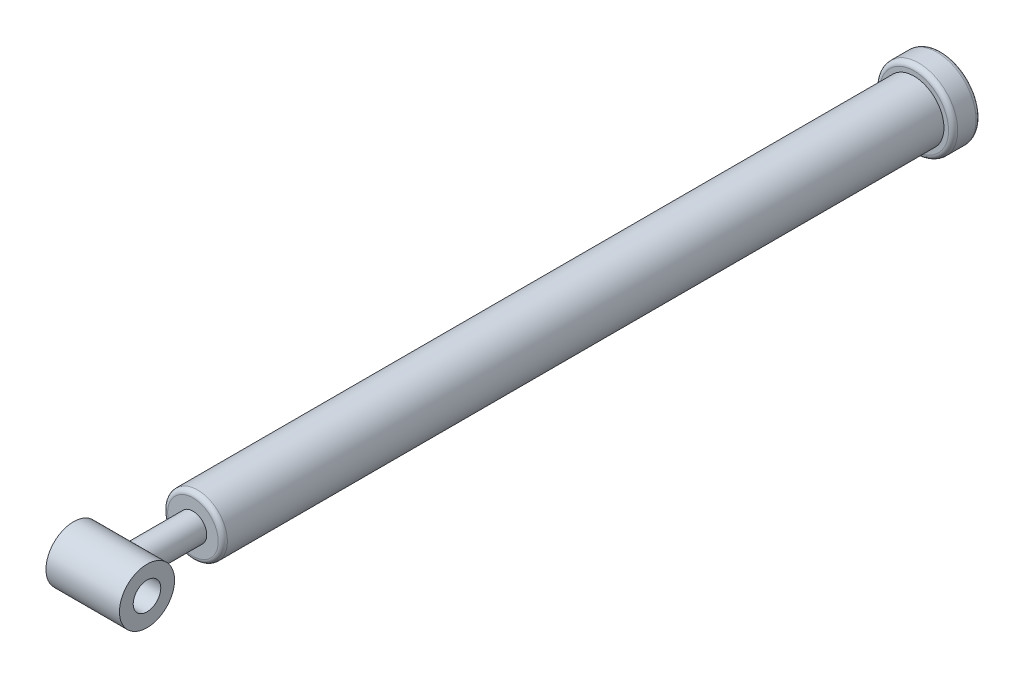
ISO-10303-21;
HEADER;
FILE_DESCRIPTION(('STEP AP214'),'2;1');
FILE_NAME('part.step','',(''),(''),'','','');
FILE_SCHEMA(('AUTOMOTIVE_DESIGN { 1 0 10303 214 1 1 1 1 }'));
ENDSEC;
DATA;
#1=APPLICATION_CONTEXT('core data for automotive mechanical design processes');
#2=APPLICATION_PROTOCOL_DEFINITION('international standard','automotive_design',2000,#1);
#3=PRODUCT_CONTEXT('',#1,'mechanical');
#4=PRODUCT('Part','Part','',(#3));
#5=PRODUCT_RELATED_PRODUCT_CATEGORY('part','',(#4));
#6=PRODUCT_DEFINITION_FORMATION('','',#4);
#7=PRODUCT_DEFINITION_CONTEXT('part definition',#1,'design');
#8=PRODUCT_DEFINITION('design','',#6,#7);
#9=PRODUCT_DEFINITION_SHAPE('','',#8);
#10=(LENGTH_UNIT() NAMED_UNIT(*) SI_UNIT(.MILLI.,.METRE.));
#11=(NAMED_UNIT(*) PLANE_ANGLE_UNIT() SI_UNIT($,.RADIAN.));
#12=(NAMED_UNIT(*) SI_UNIT($,.STERADIAN.) SOLID_ANGLE_UNIT());
#13=UNCERTAINTY_MEASURE_WITH_UNIT(LENGTH_MEASURE(1.E-05),#10,'distance_accuracy_value','');
#14=(GEOMETRIC_REPRESENTATION_CONTEXT(3) GLOBAL_UNCERTAINTY_ASSIGNED_CONTEXT((#13)) GLOBAL_UNIT_ASSIGNED_CONTEXT((#10,
#11,#12)) REPRESENTATION_CONTEXT('',''));
#15=CARTESIAN_POINT('',(0.,0.,0.));
#16=DIRECTION('',(0.,0.,1.));
#17=DIRECTION('',(1.,0.,0.));
#18=AXIS2_PLACEMENT_3D('',#15,#16,#17);
#19=CARTESIAN_POINT('',(0.,0.,850.));
#20=DIRECTION('',(0.,0.,-1.));
#21=DIRECTION('',(-1.,0.,0.));
#22=AXIS2_PLACEMENT_3D('',#19,#20,#21);
#23=CYLINDRICAL_SURFACE('',#22,15.);
#24=CARTESIAN_POINT('',(0.,0.,785.));
#25=DIRECTION('',(0.,0.,1.));
#26=DIRECTION('',(1.,0.,0.));
#27=AXIS2_PLACEMENT_3D('',#24,#25,#26);
#28=CIRCLE('',#27,15.);
#29=CARTESIAN_POINT('',(15.,0.,785.));
#30=VERTEX_POINT('',#29);
#31=EDGE_CURVE('E75',#30,#30,#28,.T.);
#32=ORIENTED_EDGE('',*,*,#31,.T.);
#33=EDGE_LOOP('',(#32));
#34=FACE_BOUND('',#33,.T.);
#35=CARTESIAN_POINT('',(-15.,0.,845.));
#36=CARTESIAN_POINT('',(-14.9999986967893,-0.394466621474774,845.000001198443));
#37=CARTESIAN_POINT('',(-14.9844217290986,-0.788960822893599,845.007798374441));
#38=CARTESIAN_POINT('',(-14.9222912626951,-1.57504384672489,845.038790696874));
#39=CARTESIAN_POINT('',(-14.8757242881962,-1.96663133023565,845.061992541911));
#40=CARTESIAN_POINT('',(-14.752062134402,-2.74444839066597,845.123245665512));
#41=CARTESIAN_POINT('',(-14.674915671778,-3.13066783309048,845.16132188759));
#42=CARTESIAN_POINT('',(-14.4909926788045,-3.89427274204148,845.251345482788));
#43=CARTESIAN_POINT('',(-14.3842191117729,-4.27165908796738,845.303291468627));
#44=CARTESIAN_POINT('',(-14.1426464967422,-5.01370255233915,845.419545464834));
#45=CARTESIAN_POINT('',(-14.0079586988167,-5.37840368544457,845.483804328683));
#46=CARTESIAN_POINT('',(-13.7115835174738,-6.09447648128181,845.623301187505));
#47=CARTESIAN_POINT('',(-13.5498955527415,-6.4458478568234,845.69853941886));
#48=CARTESIAN_POINT('',(-13.2009461452605,-7.1332709828304,845.858261390877));
#49=CARTESIAN_POINT('',(-13.0136941461368,-7.46932832959928,845.942741715132));
#50=CARTESIAN_POINT('',(-12.6148696065897,-8.12479620523714,846.119159593015));
#51=CARTESIAN_POINT('',(-12.4032874777652,-8.44420009848104,846.211100082431));
#52=CARTESIAN_POINT('',(-11.9437431549207,-9.08356730455508,846.406169485422));
#53=CARTESIAN_POINT('',(-11.6943566948693,-9.40240338911199,846.509638755958));
#54=CARTESIAN_POINT('',(-11.1713323045257,-10.0182110858624,846.720301058942));
#55=CARTESIAN_POINT('',(-10.8976929878613,-10.3151814463611,846.827494304051));
#56=CARTESIAN_POINT('',(-10.32744213221,-10.8860835918351,847.043134053405));
#57=CARTESIAN_POINT('',(-10.0308163772597,-11.1600008976787,847.151581297343));
#58=CARTESIAN_POINT('',(-9.41609706949254,-11.6833254232374,847.367048472574));
#59=CARTESIAN_POINT('',(-9.09799950074795,-11.9327280363632,847.474068132354));
#60=CARTESIAN_POINT('',(-8.41621019135655,-12.424066666325,847.692119687857));
#61=CARTESIAN_POINT('',(-8.05089693128163,-12.6639084928373,847.802814953086));
#62=CARTESIAN_POINT('',(-7.29906225682785,-13.1116371457317,848.01581142987));
#63=CARTESIAN_POINT('',(-6.91254992484986,-13.319537514021,848.118116190041));
#64=CARTESIAN_POINT('',(-6.12045119528938,-13.7015816677248,848.310817756053));
#65=CARTESIAN_POINT('',(-5.71487061752195,-13.8757356708103,848.40121816361));
#66=CARTESIAN_POINT('',(-4.88717106989483,-14.1884178363296,848.566685065391));
#67=CARTESIAN_POINT('',(-4.46505393858207,-14.3269499463523,848.641753258529));
#68=CARTESIAN_POINT('',(-3.6331274396609,-14.5593818816456,848.769465636118));
#69=CARTESIAN_POINT('',(-3.22409061692206,-14.6554546162323,848.823181991672));
#70=CARTESIAN_POINT('',(-2.3974253026042,-14.8131483158836,848.912093372582));
#71=CARTESIAN_POINT('',(-1.97979717934038,-14.874770754679,848.947289190214));
#72=CARTESIAN_POINT('',(-1.1399780978413,-14.9625716596024,848.997615020556));
#73=CARTESIAN_POINT('',(-0.717791304375857,-14.9887801055065,849.012762005415));
#74=CARTESIAN_POINT('',(0.127503752153197,-15.0054120092055,849.022361014937));
#75=CARTESIAN_POINT('',(0.550611923450829,-14.9958388811994,849.016815014078));
#76=CARTESIAN_POINT('',(1.34318604493256,-14.9443693637688,848.987185469988));
#77=CARTESIAN_POINT('',(1.7130074967434,-14.9064815133301,848.965401642622));
#78=CARTESIAN_POINT('',(2.44761394651885,-14.8036048078167,848.90676729953));
#79=CARTESIAN_POINT('',(2.81239941379462,-14.7386184959446,848.869918197694));
#80=CARTESIAN_POINT('',(3.53465011425935,-14.5822778462236,848.782349877417));
#81=CARTESIAN_POINT('',(3.89211348946939,-14.490916902454,848.731627184297));
#82=CARTESIAN_POINT('',(4.59755097022409,-14.2827793732036,848.617879915435));
#83=CARTESIAN_POINT('',(4.94552456919406,-14.1660014339124,848.554854684428));
#84=CARTESIAN_POINT('',(5.63806138553527,-13.9051185945145,848.416735657268));
#85=CARTESIAN_POINT('',(5.98236177926317,-13.7604466030275,848.341397479624));
#86=CARTESIAN_POINT('',(6.65764881287022,-13.4467240006948,848.181786349803));
#87=CARTESIAN_POINT('',(6.98863063670922,-13.2776646708395,848.097510204973));
#88=CARTESIAN_POINT('',(7.63583954119811,-12.9163207460711,847.922168121219));
#89=CARTESIAN_POINT('',(7.95206429387359,-12.7240325037789,847.831101116863));
#90=CARTESIAN_POINT('',(8.56852275615353,-12.3173373374607,847.644319137144));
#91=CARTESIAN_POINT('',(8.86875518007754,-12.1029286391493,847.548603789262));
#92=CARTESIAN_POINT('',(9.4892135610555,-11.6244221009996,847.342288154575));
#93=CARTESIAN_POINT('',(9.80713018813408,-11.357472454083,847.23134228918));
#94=CARTESIAN_POINT('',(10.4195910602953,-10.7983337273758,847.009171948651));
#95=CARTESIAN_POINT('',(10.7141433900476,-10.5061534517949,846.897947583749));
#96=CARTESIAN_POINT('',(11.2787205781467,-9.89761910582899,846.677890344788));
#97=CARTESIAN_POINT('',(11.5487236024522,-9.58124396820908,846.569059663621));
#98=CARTESIAN_POINT('',(12.0621805278786,-8.92619254193719,846.356648454252));
#99=CARTESIAN_POINT('',(12.3056450163623,-8.58752523371367,846.253065841263));
#100=CARTESIAN_POINT('',(12.7751937974681,-7.87309152384946,846.049027950798));
#101=CARTESIAN_POINT('',(12.999931268877,-7.49633062281164,845.94894596163));
#102=CARTESIAN_POINT('',(13.4165538554255,-6.72229496746225,845.760139769321));
#103=CARTESIAN_POINT('',(13.608437440683,-6.32501925897374,845.671416095143));
#104=CARTESIAN_POINT('',(13.9571914545699,-5.51289034160744,845.507976152198));
#105=CARTESIAN_POINT('',(14.1140841452216,-5.09804850978522,845.433250982128));
#106=CARTESIAN_POINT('',(14.391076168471,-4.25373396764104,845.300028469866));
#107=CARTESIAN_POINT('',(14.5111797336915,-3.82426294674312,845.241529260936));
#108=CARTESIAN_POINT('',(14.7045987917793,-2.99040123124789,845.146713024642));
#109=CARTESIAN_POINT('',(14.780965864728,-2.58687987737183,845.108959937918));
#110=CARTESIAN_POINT('',(14.9004227368483,-1.77375891598894,845.049709617986));
#111=CARTESIAN_POINT('',(14.9435143460633,-1.36415964033065,845.028211500579));
#112=CARTESIAN_POINT('',(14.9958394822899,-0.542432179601618,845.002088586177));
#113=CARTESIAN_POINT('',(15.0050865466642,-0.130305071717037,844.997457042783));
#114=CARTESIAN_POINT('',(14.9896332143828,0.693142933067776,845.005182902425));
#115=CARTESIAN_POINT('',(14.9649343201033,1.10446386484084,845.017539553599));
#116=CARTESIAN_POINT('',(14.8851569218173,1.89104365716466,845.057274299687));
#117=CARTESIAN_POINT('',(14.8325856924447,2.26662317638414,845.083411784036));
#118=CARTESIAN_POINT('',(14.6994449555599,3.01155508953995,845.149198828482));
#119=CARTESIAN_POINT('',(14.6188772495211,3.38090788254089,845.188847519177));
#120=CARTESIAN_POINT('',(14.4305792041858,4.11102643115709,845.280732355606));
#121=CARTESIAN_POINT('',(14.322847354219,4.47179170797618,845.332969201392));
#122=CARTESIAN_POINT('',(14.0812572947496,5.18257720416893,845.448848110263));
#123=CARTESIAN_POINT('',(13.9473979874992,5.53259697135359,845.512490652549));
#124=CARTESIAN_POINT('',(13.6505393721982,6.22979935488015,845.651753782206));
#125=CARTESIAN_POINT('',(13.4868176517073,6.576616120173,845.727664302393));
#126=CARTESIAN_POINT('',(13.1343016754682,7.25508680349727,845.88839960015));
#127=CARTESIAN_POINT('',(12.9455071994249,7.58674058826881,845.973224456043));
#128=CARTESIAN_POINT('',(12.5441531585986,8.23341158684491,846.149985850757));
#129=CARTESIAN_POINT('',(12.3315897999932,8.54842613296244,846.241923524154));
#130=CARTESIAN_POINT('',(11.8839483671782,9.16054648853287,846.431012285166));
#131=CARTESIAN_POINT('',(11.6488615394066,9.45764526147817,846.528165393215));
#132=CARTESIAN_POINT('',(11.1333715012893,10.060839107335,846.735341464201));
#133=CARTESIAN_POINT('',(10.8507851186195,10.3649587307601,846.845692143983));
#134=CARTESIAN_POINT('',(10.2616154855625,10.9485707923032,847.06746929941));
#135=CARTESIAN_POINT('',(9.9550311697726,11.2280621358615,847.178895822626));
#136=CARTESIAN_POINT('',(9.31919419442999,11.761157874002,847.400027289832));
#137=CARTESIAN_POINT('',(8.98992792709478,12.0147464980315,847.50973115101));
#138=CARTESIAN_POINT('',(8.31037887445767,12.4944228999317,847.724397948994));
#139=CARTESIAN_POINT('',(7.96009249191951,12.7205059505332,847.829360068912));
#140=CARTESIAN_POINT('',(7.22261605950783,13.1539172060939,848.036414537208));
#141=CARTESIAN_POINT('',(6.83445930863627,13.3597919511091,848.138116937488));
#142=CARTESIAN_POINT('',(6.03927850598328,13.737567232961,848.329340387484));
#143=CARTESIAN_POINT('',(5.63226376216402,13.9094843147169,848.418867362678));
#144=CARTESIAN_POINT('',(4.80217565091482,14.2174151642657,848.582288068273));
#145=CARTESIAN_POINT('',(4.37911544662186,14.353457663537,848.656194299646));
#146=CARTESIAN_POINT('',(3.51992505793521,14.5879514095295,848.78531598748));
#147=CARTESIAN_POINT('',(3.08379690851378,14.6864084766722,848.840534337767));
#148=CARTESIAN_POINT('',(2.24471283239244,14.8366134509912,848.925460869571));
#149=CARTESIAN_POINT('',(1.84259137531863,14.8919378625023,848.957109030588));
#150=CARTESIAN_POINT('',(1.0341590037221,14.9698153891526,849.0017947784));
#151=CARTESIAN_POINT('',(0.627848376009429,14.9923707330054,849.014833630864));
#152=CARTESIAN_POINT('',(-0.185270351507961,15.0043645010929,849.021757365319));
#153=CARTESIAN_POINT('',(-0.592078211651137,14.9938151743778,849.015649331845));
#154=CARTESIAN_POINT('',(-1.40275816467969,14.9397884815991,848.984549012312));
#155=CARTESIAN_POINT('',(-1.8066303770658,14.8963124635393,848.959557499333));
#156=CARTESIAN_POINT('',(-2.56967168244059,14.782795841076,848.894967278986));
#157=CARTESIAN_POINT('',(-2.92942204471818,14.7156934571528,848.856994150101));
#158=CARTESIAN_POINT('',(-3.64159381579529,14.5558242789108,848.767646667704));
#159=CARTESIAN_POINT('',(-3.99401275857395,14.4630489945772,848.716267881271));
#160=CARTESIAN_POINT('',(-4.68939648000361,14.2527724980854,848.601651711384));
#161=CARTESIAN_POINT('',(-5.03236114606179,14.1352709916016,848.538414186772));
#162=CARTESIAN_POINT('',(-5.707164316817,13.8765585244577,848.401832636467));
#163=CARTESIAN_POINT('',(-6.03900172289249,13.7353452308956,848.328487616466));
#164=CARTESIAN_POINT('',(-6.71194905721808,13.4200195538921,848.16836954442));
#165=CARTESIAN_POINT('',(-7.05218633738287,13.2443351386714,848.081025622915));
#166=CARTESIAN_POINT('',(-7.71683729888767,12.8684192321827,847.899310742732));
#167=CARTESIAN_POINT('',(-8.04125049766908,12.6681869929773,847.804939569978));
#168=CARTESIAN_POINT('',(-8.67307599887717,12.2442855818538,847.611466647555));
#169=CARTESIAN_POINT('',(-8.9804818359264,12.0206075892618,847.512363125188));
#170=CARTESIAN_POINT('',(-9.57700095794095,11.5509819278367,847.311734819274));
#171=CARTESIAN_POINT('',(-9.86611149224955,11.3050309237573,847.210209674785));
#172=CARTESIAN_POINT('',(-10.4588881043877,10.7607009160988,846.994588016576));
#173=CARTESIAN_POINT('',(-10.7600384098886,10.4595848725634,846.880466375821));
#174=CARTESIAN_POINT('',(-11.3360350079751,9.83237263592984,846.655062843985));
#175=CARTESIAN_POINT('',(-11.6108894699081,9.50628425805799,846.543780078878));
#176=CARTESIAN_POINT('',(-12.1328673274452,8.83040064495091,846.326840554529));
#177=CARTESIAN_POINT('',(-12.3799686513198,8.48058689086186,846.221188307768));
#178=CARTESIAN_POINT('',(-12.8443186951047,7.75934315416605,846.018404213271));
#179=CARTESIAN_POINT('',(-13.0615691351246,7.38791441884539,845.921271874707));
#180=CARTESIAN_POINT('',(-13.4657554418474,6.62283359834587,845.737499586337));
#181=CARTESIAN_POINT('',(-13.652463307469,6.22904153096556,845.650939674485));
#182=CARTESIAN_POINT('',(-13.9917304392215,5.42422205013373,845.491593102566));
#183=CARTESIAN_POINT('',(-14.1442848128173,5.01319217734312,845.418808416049));
#184=CARTESIAN_POINT('',(-14.4130312534336,4.17809175418138,845.289368363161));
#185=CARTESIAN_POINT('',(-14.52931393542,3.75405665560561,845.232672834932));
#186=CARTESIAN_POINT('',(-14.7244141315277,2.89570983328148,845.136960690795));
#187=CARTESIAN_POINT('',(-14.8032545313493,2.46140455781254,845.097933276359));
#188=CARTESIAN_POINT('',(-14.9084233559045,1.68912528485808,845.04570850057));
#189=CARTESIAN_POINT('',(-14.9427351996439,1.35247752005867,845.028597786956));
#190=CARTESIAN_POINT('',(-14.9885243961843,0.677226647280003,845.005742865413));
#191=CARTESIAN_POINT('',(-15.0000011187201,0.338623485589113,844.999998971216));
#192=CARTESIAN_POINT('',(-15.,0.,845.));
#193=B_SPLINE_CURVE_WITH_KNOTS('',3,(#35,#36,#37,#38,#39,#40,#41,#42,#43,#44,#45,#46,#47,#48,
#49,#50,#51,#52,#53,#54,#55,#56,#57,#58,#59,#60,#61,#62,#63,#64,#65,#66,#67,#68,#69,#70,#71,#72,
#73,#74,#75,#76,#77,#78,#79,#80,#81,#82,#83,#84,#85,#86,#87,#88,#89,#90,#91,#92,#93,#94,#95,#96,
#97,#98,#99,#100,#101,#102,#103,#104,#105,#106,#107,#108,#109,#110,#111,#112,#113,#114,#115,
#116,#117,#118,#119,#120,#121,#122,#123,#124,#125,#126,#127,#128,#129,#130,#131,#132,#133,#134,
#135,#136,#137,#138,#139,#140,#141,#142,#143,#144,#145,#146,#147,#148,#149,#150,#151,#152,#153,
#154,#155,#156,#157,#158,#159,#160,#161,#162,#163,#164,#165,#166,#167,#168,#169,#170,#171,#172,
#173,#174,#175,#176,#177,#178,#179,#180,#181,#182,#183,#184,#185,#186,#187,#188,#189,#190,#191,
#192),.UNSPECIFIED.,.T.,.F.,(4,2,2,2,2,2,2,2,2,2,2,2,2,2,2,2,2,2,2,2,2,2,2,2,2,2,2,2,2,2,2,2,2,
2,2,2,2,2,2,2,2,2,2,2,2,2,2,2,2,2,2,2,2,2,2,2,2,2,2,2,2,2,2,2,2,2,2,2,2,2,2,2,2,2,2,2,2,2,4),
(0.,1.1830658838765,2.36664655205927,3.5522205995842,4.73767610811696,5.91849492154762,
7.09933916134022,8.27974835920211,9.46062435602728,10.7126941080732,11.9648354787241,
13.2177575130875,14.4709145374422,15.821667201721,17.1718456109054,18.521614574237,
19.8712338927467,21.1401798733571,22.4090715662491,23.6768884023223,24.9445842691985,
26.0604534443427,27.1762179182402,28.2922620948529,29.4083657309785,30.5501573825651,
31.6923582661887,32.8347387306652,33.9772108970053,35.2649000045823,36.5521415758273,
37.8405170382692,39.1283766165388,40.4765138704576,41.824713885002,43.1720536807209,
44.519238405488,45.7548292237563,46.9903528264139,48.2253821822107,49.4603568799793,
50.5994583371909,51.7384865108584,52.8775780428886,54.0167174442702,55.1883567290371,
56.3600063087793,57.5318431666801,58.7041373111917,59.9914055352965,61.2787309408958,
62.5668355046821,63.8551611378706,65.2063513889894,66.5568816778176,67.9063270370394,
69.2555633384069,70.4752824018563,71.6949185050053,72.9141033841497,74.1332383531126,
75.2357784731186,76.3386836391977,77.4416019343193,78.5446288045349,79.7216927437009,
80.8987925552604,82.0763368112874,83.2540576898123,84.5752168212047,85.8959641652359,
87.217754555028,88.5394687467831,89.8706389488176,91.2019997209938,92.5300073067729,
93.8572021316087,94.872757858524,95.8883416150965),.UNSPECIFIED.);
#194=CARTESIAN_POINT('',(-15.,0.,845.));
#195=VERTEX_POINT('',#194);
#196=EDGE_CURVE('E67',#195,#195,#193,.T.);
#197=ORIENTED_EDGE('',*,*,#196,.F.);
#198=EDGE_LOOP('',(#197));
#199=FACE_BOUND('',#198,.T.);
#200=ADVANCED_FACE('F41',(#34,#199),#23,.T.);
#201=CARTESIAN_POINT('',(0.,0.,0.));
#202=DIRECTION('',(0.,0.,1.));
#203=DIRECTION('',(1.,0.,0.));
#204=AXIS2_PLACEMENT_3D('',#201,#202,#203);
#205=PLANE('',#204);
#206=CARTESIAN_POINT('',(0.,0.,0.));
#207=DIRECTION('',(0.,0.,1.));
#208=DIRECTION('',(1.,0.,0.));
#209=AXIS2_PLACEMENT_3D('',#206,#207,#208);
#210=CIRCLE('',#209,37.5);
#211=CARTESIAN_POINT('',(37.5,0.,0.));
#212=VERTEX_POINT('',#211);
#213=EDGE_CURVE('E64',#212,#212,#210,.T.);
#214=ORIENTED_EDGE('',*,*,#213,.T.);
#215=EDGE_LOOP('',(#214));
#216=FACE_BOUND('',#215,.T.);
#217=CARTESIAN_POINT('',(0.,0.,0.));
#218=DIRECTION('',(0.,0.,1.));
#219=DIRECTION('',(1.,0.,0.));
#220=AXIS2_PLACEMENT_3D('',#217,#218,#219);
#221=CIRCLE('',#220,32.5);
#222=CARTESIAN_POINT('',(32.5,0.,0.));
#223=VERTEX_POINT('',#222);
#224=EDGE_CURVE('E123',#223,#223,#221,.T.);
#225=ORIENTED_EDGE('',*,*,#224,.F.);
#226=EDGE_LOOP('',(#225));
#227=FACE_BOUND('',#226,.T.);
#228=ADVANCED_FACE('F107',(#216,#227),#205,.T.);
#229=CARTESIAN_POINT('',(0.,0.,-30.));
#230=DIRECTION('',(0.,0.,1.));
#231=DIRECTION('',(1.,0.,0.));
#232=AXIS2_PLACEMENT_3D('',#229,#230,#231);
#233=CYLINDRICAL_SURFACE('',#232,42.5);
#234=CARTESIAN_POINT('',(0.,0.,-5.));
#235=DIRECTION('',(0.,0.,1.));
#236=DIRECTION('',(1.,0.,0.));
#237=AXIS2_PLACEMENT_3D('',#234,#235,#236);
#238=CIRCLE('',#237,42.5);
#239=CARTESIAN_POINT('',(42.5,0.,-5.));
#240=VERTEX_POINT('',#239);
#241=EDGE_CURVE('E56',#240,#240,#238,.F.);
#242=ORIENTED_EDGE('',*,*,#241,.T.);
#243=EDGE_LOOP('',(#242));
#244=FACE_BOUND('',#243,.T.);
#245=CARTESIAN_POINT('',(0.,0.,-25.));
#246=DIRECTION('',(0.,0.,1.));
#247=DIRECTION('',(1.,0.,0.));
#248=AXIS2_PLACEMENT_3D('',#245,#246,#247);
#249=CIRCLE('',#248,42.5);
#250=CARTESIAN_POINT('',(42.5,0.,-25.));
#251=VERTEX_POINT('',#250);
#252=EDGE_CURVE('E61',#251,#251,#249,.T.);
#253=ORIENTED_EDGE('',*,*,#252,.T.);
#254=EDGE_LOOP('',(#253));
#255=FACE_BOUND('',#254,.T.);
#256=ADVANCED_FACE('F112',(#244,#255),#233,.T.);
#257=CARTESIAN_POINT('',(0.,0.,-30.));
#258=DIRECTION('',(0.,0.,1.));
#259=DIRECTION('',(1.,0.,0.));
#260=AXIS2_PLACEMENT_3D('',#257,#258,#259);
#261=PLANE('',#260);
#262=CARTESIAN_POINT('',(0.,0.,-30.));
#263=DIRECTION('',(0.,0.,1.));
#264=DIRECTION('',(1.,0.,0.));
#265=AXIS2_PLACEMENT_3D('',#262,#263,#264);
#266=CIRCLE('',#265,37.5);
#267=CARTESIAN_POINT('',(37.5,0.,-30.));
#268=VERTEX_POINT('',#267);
#269=EDGE_CURVE('E52',#268,#268,#266,.F.);
#270=ORIENTED_EDGE('',*,*,#269,.T.);
#271=EDGE_LOOP('',(#270));
#272=FACE_BOUND('',#271,.T.);
#273=CARTESIAN_POINT('',(0.,0.,-30.));
#274=DIRECTION('',(0.,0.,1.));
#275=DIRECTION('',(1.,0.,0.));
#276=AXIS2_PLACEMENT_3D('',#273,#274,#275);
#277=CIRCLE('',#276,20.);
#278=CARTESIAN_POINT('',(20.,0.,-30.));
#279=VERTEX_POINT('',#278);
#280=EDGE_CURVE('E76',#279,#279,#277,.T.);
#281=ORIENTED_EDGE('',*,*,#280,.T.);
#282=EDGE_LOOP('',(#281));
#283=FACE_BOUND('',#282,.T.);
#284=ADVANCED_FACE('F146',(#272,#283),#261,.F.);
#285=CARTESIAN_POINT('',(0.,0.,-30.));
#286=DIRECTION('',(0.,0.,1.));
#287=DIRECTION('',(1.,0.,0.));
#288=AXIS2_PLACEMENT_3D('',#285,#286,#287);
#289=CYLINDRICAL_SURFACE('',#288,20.);
#290=ORIENTED_EDGE('',*,*,#280,.F.);
#291=EDGE_LOOP('',(#290));
#292=FACE_BOUND('',#291,.T.);
#293=CARTESIAN_POINT('',(0.,0.,780.));
#294=DIRECTION('',(0.,0.,1.));
#295=DIRECTION('',(1.,0.,0.));
#296=AXIS2_PLACEMENT_3D('',#293,#294,#295);
#297=CIRCLE('',#296,20.);
#298=CARTESIAN_POINT('',(20.,0.,780.));
#299=VERTEX_POINT('',#298);
#300=EDGE_CURVE('E128',#299,#299,#297,.T.);
#301=ORIENTED_EDGE('',*,*,#300,.T.);
#302=EDGE_LOOP('',(#301));
#303=FACE_BOUND('',#302,.T.);
#304=ADVANCED_FACE('F138',(#292,#303),#289,.F.);
#305=CARTESIAN_POINT('',(0.,0.,780.));
#306=DIRECTION('',(0.,0.,-1.));
#307=DIRECTION('',(-1.,0.,0.));
#308=AXIS2_PLACEMENT_3D('',#305,#306,#307);
#309=CYLINDRICAL_SURFACE('',#308,32.5);
#310=CARTESIAN_POINT('',(0.,0.,780.));
#311=DIRECTION('',(0.,0.,1.));
#312=DIRECTION('',(1.,0.,0.));
#313=AXIS2_PLACEMENT_3D('',#310,#311,#312);
#314=CIRCLE('',#313,32.5);
#315=CARTESIAN_POINT('',(32.5,0.,780.));
#316=VERTEX_POINT('',#315);
#317=EDGE_CURVE('E10',#316,#316,#314,.F.);
#318=ORIENTED_EDGE('',*,*,#317,.T.);
#319=EDGE_LOOP('',(#318));
#320=FACE_BOUND('',#319,.T.);
#321=ORIENTED_EDGE('',*,*,#224,.T.);
#322=EDGE_LOOP('',(#321));
#323=FACE_BOUND('',#322,.T.);
#324=ADVANCED_FACE('F134',(#320,#323),#309,.T.);
#325=CARTESIAN_POINT('',(0.,0.,780.));
#326=DIRECTION('',(0.,0.,1.));
#327=DIRECTION('',(1.,0.,0.));
#328=AXIS2_PLACEMENT_3D('',#325,#326,#327);
#329=PLANE('',#328);
#330=ORIENTED_EDGE('',*,*,#300,.F.);
#331=EDGE_LOOP('',(#330));
#332=FACE_BOUND('',#331,.T.);
#333=ADVANCED_FACE('F137',(#332),#329,.F.);
#334=CARTESIAN_POINT('',(0.,0.,785.));
#335=DIRECTION('',(0.,0.,1.));
#336=DIRECTION('',(1.,0.,0.));
#337=AXIS2_PLACEMENT_3D('',#334,#335,#336);
#338=PLANE('',#337);
#339=CARTESIAN_POINT('',(0.,0.,785.));
#340=DIRECTION('',(0.,0.,1.));
#341=DIRECTION('',(1.,0.,0.));
#342=AXIS2_PLACEMENT_3D('',#339,#340,#341);
#343=CIRCLE('',#342,27.5);
#344=CARTESIAN_POINT('',(27.5,0.,785.));
#345=VERTEX_POINT('',#344);
#346=EDGE_CURVE('E48',#345,#345,#343,.T.);
#347=ORIENTED_EDGE('',*,*,#346,.T.);
#348=EDGE_LOOP('',(#347));
#349=FACE_BOUND('',#348,.T.);
#350=ORIENTED_EDGE('',*,*,#31,.F.);
#351=EDGE_LOOP('',(#350));
#352=FACE_BOUND('',#351,.T.);
#353=ADVANCED_FACE('F85',(#349,#352),#338,.T.);
#354=CARTESIAN_POINT('',(40.,0.,875.));
#355=DIRECTION('',(-1.,0.,0.));
#356=DIRECTION('',(0.,0.,1.));
#357=AXIS2_PLACEMENT_3D('',#354,#355,#356);
#358=CYLINDRICAL_SURFACE('',#357,30.);
#359=CARTESIAN_POINT('',(-40.,0.,875.));
#360=DIRECTION('',(1.,0.,0.));
#361=DIRECTION('',(0.,0.,-1.));
#362=AXIS2_PLACEMENT_3D('',#359,#360,#361);
#363=CIRCLE('',#362,30.);
#364=CARTESIAN_POINT('',(-40.,0.,845.));
#365=VERTEX_POINT('',#364);
#366=EDGE_CURVE('E126',#365,#365,#363,.T.);
#367=ORIENTED_EDGE('',*,*,#366,.T.);
#368=EDGE_LOOP('',(#367));
#369=FACE_BOUND('',#368,.T.);
#370=CARTESIAN_POINT('',(40.,0.,875.));
#371=DIRECTION('',(1.,0.,0.));
#372=DIRECTION('',(0.,0.,-1.));
#373=AXIS2_PLACEMENT_3D('',#370,#371,#372);
#374=CIRCLE('',#373,30.);
#375=CARTESIAN_POINT('',(40.,0.,845.));
#376=VERTEX_POINT('',#375);
#377=EDGE_CURVE('E130',#376,#376,#374,.T.);
#378=ORIENTED_EDGE('',*,*,#377,.F.);
#379=EDGE_LOOP('',(#378));
#380=FACE_BOUND('',#379,.T.);
#381=ORIENTED_EDGE('',*,*,#196,.T.);
#382=EDGE_LOOP('',(#381));
#383=FACE_BOUND('',#382,.T.);
#384=ADVANCED_FACE('F80',(#369,#380,#383),#358,.T.);
#385=CARTESIAN_POINT('',(40.,0.,875.));
#386=DIRECTION('',(1.,0.,0.));
#387=DIRECTION('',(0.,0.,-1.));
#388=AXIS2_PLACEMENT_3D('',#385,#386,#387);
#389=PLANE('',#388);
#390=ORIENTED_EDGE('',*,*,#377,.T.);
#391=EDGE_LOOP('',(#390));
#392=FACE_BOUND('',#391,.T.);
#393=CARTESIAN_POINT('',(40.,0.,875.));
#394=DIRECTION('',(1.,0.,0.));
#395=DIRECTION('',(0.,0.,-1.));
#396=AXIS2_PLACEMENT_3D('',#393,#394,#395);
#397=CIRCLE('',#396,15.);
#398=CARTESIAN_POINT('',(40.,0.,860.));
#399=VERTEX_POINT('',#398);
#400=EDGE_CURVE('E325',#399,#399,#397,.T.);
#401=ORIENTED_EDGE('',*,*,#400,.F.);
#402=EDGE_LOOP('',(#401));
#403=FACE_BOUND('',#402,.T.);
#404=ADVANCED_FACE('F84',(#392,#403),#389,.T.);
#405=CARTESIAN_POINT('',(-40.,0.,875.));
#406=DIRECTION('',(1.,0.,0.));
#407=DIRECTION('',(0.,0.,-1.));
#408=AXIS2_PLACEMENT_3D('',#405,#406,#407);
#409=PLANE('',#408);
#410=ORIENTED_EDGE('',*,*,#366,.F.);
#411=EDGE_LOOP('',(#410));
#412=FACE_BOUND('',#411,.T.);
#413=CARTESIAN_POINT('',(-40.,0.,875.));
#414=DIRECTION('',(1.,0.,0.));
#415=DIRECTION('',(0.,0.,-1.));
#416=AXIS2_PLACEMENT_3D('',#413,#414,#415);
#417=CIRCLE('',#416,15.);
#418=CARTESIAN_POINT('',(-40.,0.,860.));
#419=VERTEX_POINT('',#418);
#420=EDGE_CURVE('E327',#419,#419,#417,.T.);
#421=ORIENTED_EDGE('',*,*,#420,.T.);
#422=EDGE_LOOP('',(#421));
#423=FACE_BOUND('',#422,.T.);
#424=ADVANCED_FACE('F87',(#412,#423),#409,.F.);
#425=CARTESIAN_POINT('',(40.,0.,875.));
#426=DIRECTION('',(-1.,0.,0.));
#427=DIRECTION('',(0.,0.,1.));
#428=AXIS2_PLACEMENT_3D('',#425,#426,#427);
#429=CYLINDRICAL_SURFACE('',#428,15.);
#430=ORIENTED_EDGE('',*,*,#400,.T.);
#431=EDGE_LOOP('',(#430));
#432=FACE_BOUND('',#431,.T.);
#433=ORIENTED_EDGE('',*,*,#420,.F.);
#434=EDGE_LOOP('',(#433));
#435=FACE_BOUND('',#434,.T.);
#436=ADVANCED_FACE('F90',(#432,#435),#429,.F.);
#437=CARTESIAN_POINT('',(0.,0.,-5.));
#438=DIRECTION('',(0.,0.,1.));
#439=DIRECTION('',(1.,0.,0.));
#440=AXIS2_PLACEMENT_3D('',#437,#438,#439);
#441=TOROIDAL_SURFACE('',#440,37.5,5.);
#442=ORIENTED_EDGE('',*,*,#241,.F.);
#443=EDGE_LOOP('',(#442));
#444=FACE_BOUND('',#443,.T.);
#445=ORIENTED_EDGE('',*,*,#213,.F.);
#446=EDGE_LOOP('',(#445));
#447=FACE_BOUND('',#446,.T.);
#448=ADVANCED_FACE('F96',(#444,#447),#441,.T.);
#449=CARTESIAN_POINT('',(0.,0.,-25.));
#450=DIRECTION('',(0.,0.,1.));
#451=DIRECTION('',(1.,0.,0.));
#452=AXIS2_PLACEMENT_3D('',#449,#450,#451);
#453=TOROIDAL_SURFACE('',#452,37.5,5.);
#454=ORIENTED_EDGE('',*,*,#269,.F.);
#455=EDGE_LOOP('',(#454));
#456=FACE_BOUND('',#455,.T.);
#457=ORIENTED_EDGE('',*,*,#252,.F.);
#458=EDGE_LOOP('',(#457));
#459=FACE_BOUND('',#458,.T.);
#460=ADVANCED_FACE('F101',(#456,#459),#453,.T.);
#461=CARTESIAN_POINT('',(0.,0.,780.));
#462=DIRECTION('',(0.,0.,1.));
#463=DIRECTION('',(1.,0.,0.));
#464=AXIS2_PLACEMENT_3D('',#461,#462,#463);
#465=TOROIDAL_SURFACE('',#464,27.5,5.);
#466=ORIENTED_EDGE('',*,*,#317,.F.);
#467=EDGE_LOOP('',(#466));
#468=FACE_BOUND('',#467,.T.);
#469=ORIENTED_EDGE('',*,*,#346,.F.);
#470=EDGE_LOOP('',(#469));
#471=FACE_BOUND('',#470,.T.);
#472=ADVANCED_FACE('F43',(#468,#471),#465,.T.);
#473=CLOSED_SHELL('',(#200,#228,#256,#284,#304,#324,#333,#353,#384,#404,#424,#436,#448,#460,#472));
#474=MANIFOLD_SOLID_BREP('B2',#473);
#475=ADVANCED_BREP_SHAPE_REPRESENTATION('',(#18,#474),#14);
#476=SHAPE_DEFINITION_REPRESENTATION(#9,#475);
ENDSEC;
END-ISO-10303-21;
